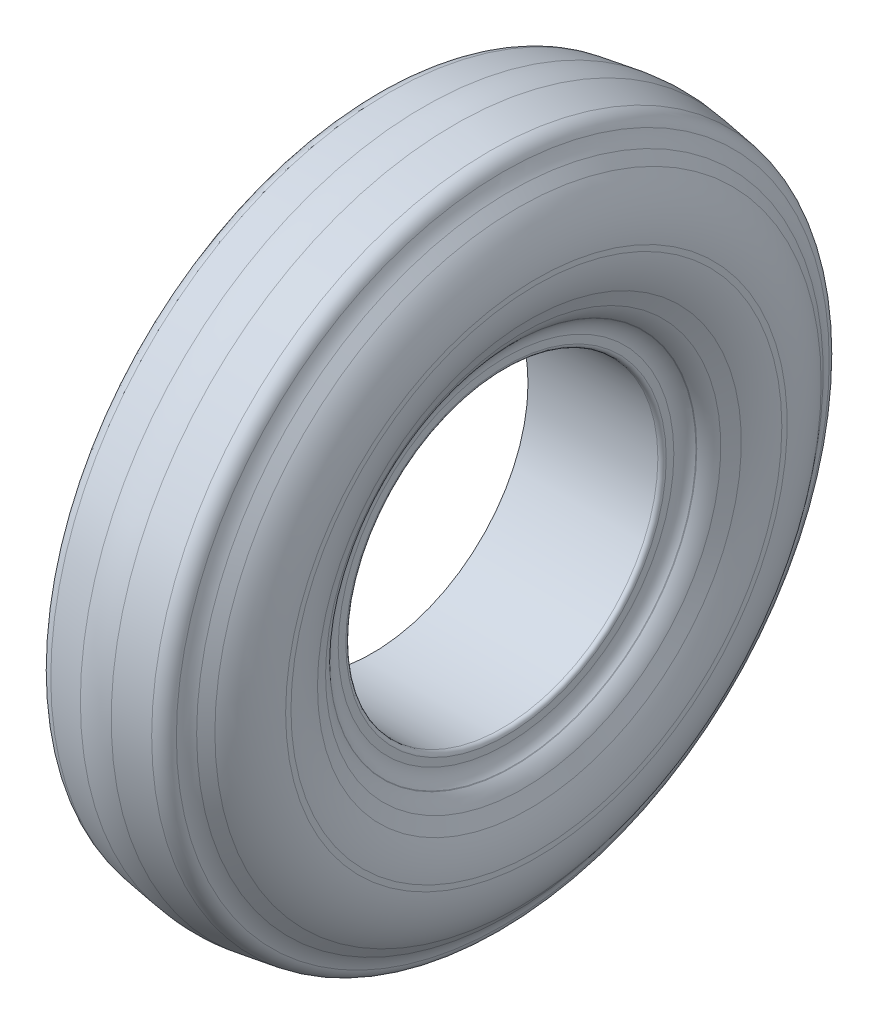
ISO-10303-21;
HEADER;
FILE_DESCRIPTION(('STEP AP214'),'2;1');
FILE_NAME('part.step','',(''),(''),'','','');
FILE_SCHEMA(('AUTOMOTIVE_DESIGN { 1 0 10303 214 1 1 1 1 }'));
ENDSEC;
DATA;
#1=APPLICATION_CONTEXT('core data for automotive mechanical design processes');
#2=APPLICATION_PROTOCOL_DEFINITION('international standard','automotive_design',2000,#1);
#3=PRODUCT_CONTEXT('',#1,'mechanical');
#4=PRODUCT('Part','Part','',(#3));
#5=PRODUCT_RELATED_PRODUCT_CATEGORY('part','',(#4));
#6=PRODUCT_DEFINITION_FORMATION('','',#4);
#7=PRODUCT_DEFINITION_CONTEXT('part definition',#1,'design');
#8=PRODUCT_DEFINITION('design','',#6,#7);
#9=PRODUCT_DEFINITION_SHAPE('','',#8);
#10=(LENGTH_UNIT() NAMED_UNIT(*) SI_UNIT(.MILLI.,.METRE.));
#11=(NAMED_UNIT(*) PLANE_ANGLE_UNIT() SI_UNIT($,.RADIAN.));
#12=(NAMED_UNIT(*) SI_UNIT($,.STERADIAN.) SOLID_ANGLE_UNIT());
#13=UNCERTAINTY_MEASURE_WITH_UNIT(LENGTH_MEASURE(1.E-05),#10,'distance_accuracy_value','');
#14=(GEOMETRIC_REPRESENTATION_CONTEXT(3) GLOBAL_UNCERTAINTY_ASSIGNED_CONTEXT((#13)) GLOBAL_UNIT_ASSIGNED_CONTEXT((#10,
#11,#12)) REPRESENTATION_CONTEXT('',''));
#15=CARTESIAN_POINT('',(0.,0.,0.));
#16=DIRECTION('',(0.,0.,1.));
#17=DIRECTION('',(1.,0.,0.));
#18=AXIS2_PLACEMENT_3D('',#15,#16,#17);
#19=CARTESIAN_POINT('',(0.,0.,0.));
#20=DIRECTION('',(-1.,0.,0.));
#21=DIRECTION('',(0.,0.,1.));
#22=AXIS2_PLACEMENT_3D('',#19,#20,#21);
#23=CYLINDRICAL_SURFACE('',#22,94.615);
#24=CARTESIAN_POINT('',(38.1,0.,0.));
#25=DIRECTION('',(-1.,0.,0.));
#26=DIRECTION('',(0.,0.,1.));
#27=AXIS2_PLACEMENT_3D('',#24,#25,#26);
#28=CIRCLE('',#27,94.615);
#29=CARTESIAN_POINT('',(38.1,0.,94.615));
#30=VERTEX_POINT('',#29);
#31=EDGE_CURVE('E10',#30,#30,#28,.F.);
#32=ORIENTED_EDGE('',*,*,#31,.T.);
#33=EDGE_LOOP('',(#32));
#34=FACE_BOUND('',#33,.T.);
#35=CARTESIAN_POINT('',(-40.64,0.,0.));
#36=DIRECTION('',(-1.,0.,0.));
#37=DIRECTION('',(0.,0.,1.));
#38=AXIS2_PLACEMENT_3D('',#35,#36,#37);
#39=CIRCLE('',#38,94.615);
#40=CARTESIAN_POINT('',(-40.64,0.,94.615));
#41=VERTEX_POINT('',#40);
#42=EDGE_CURVE('E121',#41,#41,#39,.T.);
#43=ORIENTED_EDGE('',*,*,#42,.T.);
#44=EDGE_LOOP('',(#43));
#45=FACE_BOUND('',#44,.T.);
#46=ADVANCED_FACE('F35',(#34,#45),#23,.F.);
#47=CARTESIAN_POINT('',(-40.64,94.615,0.));
#48=DIRECTION('',(1.,0.,0.));
#49=DIRECTION('',(0.,0.,-1.));
#50=AXIS2_PLACEMENT_3D('',#47,#48,#49);
#51=PLANE('',#50);
#52=CARTESIAN_POINT('',(-40.64,0.,0.));
#53=DIRECTION('',(1.,0.,0.));
#54=DIRECTION('',(0.,0.,-1.));
#55=AXIS2_PLACEMENT_3D('',#52,#53,#54);
#56=CIRCLE('',#55,101.754543356576);
#57=CARTESIAN_POINT('',(-40.64,0.,-101.754543356576));
#58=VERTEX_POINT('',#57);
#59=EDGE_CURVE('E118',#58,#58,#56,.F.);
#60=ORIENTED_EDGE('',*,*,#59,.T.);
#61=EDGE_LOOP('',(#60));
#62=FACE_BOUND('',#61,.T.);
#63=ORIENTED_EDGE('',*,*,#42,.F.);
#64=EDGE_LOOP('',(#63));
#65=FACE_BOUND('',#64,.T.);
#66=ADVANCED_FACE('F126',(#62,#65),#51,.F.);
#67=CARTESIAN_POINT('',(-48.895,0.,0.));
#68=DIRECTION('',(-1.,0.,0.));
#69=DIRECTION('',(0.,0.,1.));
#70=AXIS2_PLACEMENT_3D('',#67,#68,#69);
#71=CONICAL_SURFACE('',#70,114.935,0.745419476274158);
#72=CARTESIAN_POINT('',(-44.976770351513,0.,0.));
#73=DIRECTION('',(1.,0.,0.));
#74=DIRECTION('',(0.,0.,-1.));
#75=AXIS2_PLACEMENT_3D('',#72,#73,#74);
#76=CIRCLE('',#75,111.318172632166);
#77=CARTESIAN_POINT('',(-44.976770351513,0.,-111.318172632166));
#78=VERTEX_POINT('',#77);
#79=EDGE_CURVE('E106',#78,#78,#76,.F.);
#80=ORIENTED_EDGE('',*,*,#79,.T.);
#81=EDGE_LOOP('',(#80));
#82=FACE_BOUND('',#81,.T.);
#83=CARTESIAN_POINT('',(-44.7258426952901,0.,0.));
#84=DIRECTION('',(-1.,0.,0.));
#85=DIRECTION('',(0.,0.,1.));
#86=AXIS2_PLACEMENT_3D('',#83,#84,#85);
#87=CIRCLE('',#86,111.086547103345);
#88=CARTESIAN_POINT('',(-44.7258426952901,0.,111.086547103345));
#89=VERTEX_POINT('',#88);
#90=EDGE_CURVE('E115',#89,#89,#87,.F.);
#91=ORIENTED_EDGE('',*,*,#90,.T.);
#92=EDGE_LOOP('',(#91));
#93=FACE_BOUND('',#92,.T.);
#94=ADVANCED_FACE('F128',(#82,#93),#71,.F.);
#95=CARTESIAN_POINT('',(-59.055,0.,0.));
#96=DIRECTION('',(-1.,0.,0.));
#97=DIRECTION('',(0.,0.,1.));
#98=AXIS2_PLACEMENT_3D('',#95,#96,#97);
#99=CONICAL_SURFACE('',#98,138.214484530376,1.15927948072741);
#100=CARTESIAN_POINT('',(-54.8139690607513,0.,0.));
#101=DIRECTION('',(1.,0.,0.));
#102=DIRECTION('',(0.,0.,-1.));
#103=AXIS2_PLACEMENT_3D('',#100,#101,#102);
#104=CIRCLE('',#103,128.497061878497);
#105=CARTESIAN_POINT('',(-54.8139690607513,0.,-128.497061878497));
#106=VERTEX_POINT('',#105);
#107=EDGE_CURVE('E94',#106,#106,#104,.F.);
#108=ORIENTED_EDGE('',*,*,#107,.T.);
#109=EDGE_LOOP('',(#108));
#110=FACE_BOUND('',#109,.T.);
#111=CARTESIAN_POINT('',(-51.0279402724688,0.,0.));
#112=DIRECTION('',(1.,0.,0.));
#113=DIRECTION('',(0.,0.,-1.));
#114=AXIS2_PLACEMENT_3D('',#111,#112,#113);
#115=CIRCLE('',#114,119.822180125704);
#116=CARTESIAN_POINT('',(-51.0279402724688,0.,-119.822180125704));
#117=VERTEX_POINT('',#116);
#118=EDGE_CURVE('E103',#117,#117,#115,.T.);
#119=ORIENTED_EDGE('',*,*,#118,.T.);
#120=EDGE_LOOP('',(#119));
#121=FACE_BOUND('',#120,.T.);
#122=ADVANCED_FACE('F135',(#110,#121),#99,.F.);
#123=CARTESIAN_POINT('',(-59.055,138.214484530376,0.));
#124=DIRECTION('',(1.,0.,0.));
#125=DIRECTION('',(0.,0.,-1.));
#126=AXIS2_PLACEMENT_3D('',#123,#124,#125);
#127=PLANE('',#126);
#128=CARTESIAN_POINT('',(-59.055,0.,0.));
#129=DIRECTION('',(1.,0.,0.));
#130=DIRECTION('',(0.,0.,-1.));
#131=AXIS2_PLACEMENT_3D('',#128,#129,#130);
#132=CIRCLE('',#131,152.05073728983);
#133=CARTESIAN_POINT('',(-59.055,0.,-152.05073728983));
#134=VERTEX_POINT('',#133);
#135=EDGE_CURVE('E82',#134,#134,#132,.F.);
#136=ORIENTED_EDGE('',*,*,#135,.T.);
#137=EDGE_LOOP('',(#136));
#138=FACE_BOUND('',#137,.T.);
#139=CARTESIAN_POINT('',(-59.055,0.,0.));
#140=DIRECTION('',(1.,0.,0.));
#141=DIRECTION('',(0.,0.,-1.));
#142=AXIS2_PLACEMENT_3D('',#139,#140,#141);
#143=CIRCLE('',#142,148.817061878497);
#144=CARTESIAN_POINT('',(-59.055,0.,-148.817061878497));
#145=VERTEX_POINT('',#144);
#146=EDGE_CURVE('E91',#145,#145,#143,.T.);
#147=ORIENTED_EDGE('',*,*,#146,.T.);
#148=EDGE_LOOP('',(#147));
#149=FACE_BOUND('',#148,.T.);
#150=ADVANCED_FACE('F214',(#138,#149),#127,.F.);
#151=CARTESIAN_POINT('',(-40.005,0.,0.));
#152=DIRECTION('',(1.,0.,0.));
#153=DIRECTION('',(0.,0.,-1.));
#154=AXIS2_PLACEMENT_3D('',#151,#152,#153);
#155=CONICAL_SURFACE('',#154,193.675,0.895664793857865);
#156=CARTESIAN_POINT('',(-42.9943062941736,0.,0.));
#157=DIRECTION('',(1.,0.,0.));
#158=DIRECTION('',(0.,0.,-1.));
#159=AXIS2_PLACEMENT_3D('',#156,#157,#158);
#160=CIRCLE('',#159,189.941357635257);
#161=CARTESIAN_POINT('',(-42.9943062941736,0.,-189.941357635257));
#162=VERTEX_POINT('',#161);
#163=EDGE_CURVE('E70',#162,#162,#160,.F.);
#164=ORIENTED_EDGE('',*,*,#163,.T.);
#165=EDGE_LOOP('',(#164));
#166=FACE_BOUND('',#165,.T.);
#167=CARTESIAN_POINT('',(-47.9107372898298,0.,0.));
#168=DIRECTION('',(-1.,0.,0.));
#169=DIRECTION('',(0.,0.,1.));
#170=AXIS2_PLACEMENT_3D('',#167,#168,#169);
#171=CIRCLE('',#170,183.80073728983);
#172=CARTESIAN_POINT('',(-47.9107372898298,0.,183.80073728983));
#173=VERTEX_POINT('',#172);
#174=EDGE_CURVE('E79',#173,#173,#171,.F.);
#175=ORIENTED_EDGE('',*,*,#174,.T.);
#176=EDGE_LOOP('',(#175));
#177=FACE_BOUND('',#176,.T.);
#178=ADVANCED_FACE('F204',(#166,#177),#155,.T.);
#179=CARTESIAN_POINT('',(0.,0.,0.));
#180=DIRECTION('',(1.,0.,0.));
#181=DIRECTION('',(0.,0.,-1.));
#182=AXIS2_PLACEMENT_3D('',#179,#180,#181);
#183=CONICAL_SURFACE('',#182,209.55,0.15394466445835);
#184=CARTESIAN_POINT('',(-9.34744362653417,0.,0.));
#185=DIRECTION('',(-1.,0.,0.));
#186=DIRECTION('',(0.,0.,1.));
#187=AXIS2_PLACEMENT_3D('',#184,#185,#186);
#188=CIRCLE('',#187,208.099534609676);
#189=CARTESIAN_POINT('',(-9.34744362653417,0.,208.099534609676));
#190=VERTEX_POINT('',#189);
#191=EDGE_CURVE('E50',#190,#190,#188,.T.);
#192=ORIENTED_EDGE('',*,*,#191,.T.);
#193=EDGE_LOOP('',(#192));
#194=FACE_BOUND('',#193,.T.);
#195=CARTESIAN_POINT('',(-30.581011213572,0.,0.));
#196=DIRECTION('',(-1.,0.,0.));
#197=DIRECTION('',(0.,0.,1.));
#198=AXIS2_PLACEMENT_3D('',#195,#196,#197);
#199=CIRCLE('',#198,204.804670673756);
#200=CARTESIAN_POINT('',(-30.581011213572,0.,204.804670673756));
#201=VERTEX_POINT('',#200);
#202=EDGE_CURVE('E61',#201,#201,#199,.F.);
#203=ORIENTED_EDGE('',*,*,#202,.T.);
#204=EDGE_LOOP('',(#203));
#205=FACE_BOUND('',#204,.T.);
#206=ADVANCED_FACE('F200',(#194,#205),#183,.T.);
#207=CARTESIAN_POINT('',(36.83,0.,0.));
#208=DIRECTION('',(-1.,0.,0.));
#209=DIRECTION('',(0.,0.,1.));
#210=AXIS2_PLACEMENT_3D('',#207,#208,#209);
#211=CONICAL_SURFACE('',#210,203.835,0.15394466445835);
#212=CARTESIAN_POINT('',(9.34744362653417,0.,0.));
#213=DIRECTION('',(1.,0.,0.));
#214=DIRECTION('',(0.,0.,-1.));
#215=AXIS2_PLACEMENT_3D('',#212,#213,#214);
#216=CIRCLE('',#215,208.099534609676);
#217=CARTESIAN_POINT('',(9.34744362653417,0.,-208.099534609676));
#218=VERTEX_POINT('',#217);
#219=EDGE_CURVE('E46',#218,#218,#216,.T.);
#220=ORIENTED_EDGE('',*,*,#219,.T.);
#221=EDGE_LOOP('',(#220));
#222=FACE_BOUND('',#221,.T.);
#223=CARTESIAN_POINT('',(30.581011213572,0.,0.));
#224=DIRECTION('',(1.,0.,0.));
#225=DIRECTION('',(0.,0.,-1.));
#226=AXIS2_PLACEMENT_3D('',#223,#224,#225);
#227=CIRCLE('',#226,204.804670673756);
#228=CARTESIAN_POINT('',(30.581011213572,0.,-204.804670673756));
#229=VERTEX_POINT('',#228);
#230=EDGE_CURVE('E58',#229,#229,#227,.F.);
#231=ORIENTED_EDGE('',*,*,#230,.T.);
#232=EDGE_LOOP('',(#231));
#233=FACE_BOUND('',#232,.T.);
#234=ADVANCED_FACE('F203',(#222,#233),#211,.T.);
#235=CARTESIAN_POINT('',(59.055,0.,0.));
#236=DIRECTION('',(-1.,0.,0.));
#237=DIRECTION('',(0.,0.,1.));
#238=AXIS2_PLACEMENT_3D('',#235,#236,#237);
#239=CONICAL_SURFACE('',#238,169.881557626102,0.895664793857865);
#240=CARTESIAN_POINT('',(42.9943062941735,0.,0.));
#241=DIRECTION('',(-1.,0.,0.));
#242=DIRECTION('',(0.,0.,1.));
#243=AXIS2_PLACEMENT_3D('',#240,#241,#242);
#244=CIRCLE('',#243,189.941357635257);
#245=CARTESIAN_POINT('',(42.9943062941735,0.,189.941357635257));
#246=VERTEX_POINT('',#245);
#247=EDGE_CURVE('E67',#246,#246,#244,.F.);
#248=ORIENTED_EDGE('',*,*,#247,.T.);
#249=EDGE_LOOP('',(#248));
#250=FACE_BOUND('',#249,.T.);
#251=CARTESIAN_POINT('',(47.9107372898298,0.,0.));
#252=DIRECTION('',(1.,0.,0.));
#253=DIRECTION('',(0.,0.,-1.));
#254=AXIS2_PLACEMENT_3D('',#251,#252,#253);
#255=CIRCLE('',#254,183.80073728983);
#256=CARTESIAN_POINT('',(47.9107372898298,0.,-183.80073728983));
#257=VERTEX_POINT('',#256);
#258=EDGE_CURVE('E76',#257,#257,#255,.F.);
#259=ORIENTED_EDGE('',*,*,#258,.T.);
#260=EDGE_LOOP('',(#259));
#261=FACE_BOUND('',#260,.T.);
#262=ADVANCED_FACE('F241',(#250,#261),#239,.T.);
#263=CARTESIAN_POINT('',(59.055,138.214484530376,0.));
#264=DIRECTION('',(-1.,0.,0.));
#265=DIRECTION('',(0.,0.,1.));
#266=AXIS2_PLACEMENT_3D('',#263,#264,#265);
#267=PLANE('',#266);
#268=CARTESIAN_POINT('',(59.055,0.,0.));
#269=DIRECTION('',(-1.,0.,0.));
#270=DIRECTION('',(0.,0.,1.));
#271=AXIS2_PLACEMENT_3D('',#268,#269,#270);
#272=CIRCLE('',#271,152.05073728983);
#273=CARTESIAN_POINT('',(59.055,0.,152.05073728983));
#274=VERTEX_POINT('',#273);
#275=EDGE_CURVE('E73',#274,#274,#272,.F.);
#276=ORIENTED_EDGE('',*,*,#275,.T.);
#277=EDGE_LOOP('',(#276));
#278=FACE_BOUND('',#277,.T.);
#279=CARTESIAN_POINT('',(59.055,0.,0.));
#280=DIRECTION('',(-1.,0.,0.));
#281=DIRECTION('',(0.,0.,1.));
#282=AXIS2_PLACEMENT_3D('',#279,#280,#281);
#283=CIRCLE('',#282,148.817061878497);
#284=CARTESIAN_POINT('',(59.055,0.,148.817061878497));
#285=VERTEX_POINT('',#284);
#286=EDGE_CURVE('E88',#285,#285,#283,.T.);
#287=ORIENTED_EDGE('',*,*,#286,.T.);
#288=EDGE_LOOP('',(#287));
#289=FACE_BOUND('',#288,.T.);
#290=ADVANCED_FACE('F245',(#278,#289),#267,.F.);
#291=CARTESIAN_POINT('',(48.895,0.,0.));
#292=DIRECTION('',(1.,0.,0.));
#293=DIRECTION('',(0.,0.,-1.));
#294=AXIS2_PLACEMENT_3D('',#291,#292,#293);
#295=CONICAL_SURFACE('',#294,114.935,1.15927948072741);
#296=CARTESIAN_POINT('',(54.8139690607513,0.,0.));
#297=DIRECTION('',(-1.,0.,0.));
#298=DIRECTION('',(0.,0.,1.));
#299=AXIS2_PLACEMENT_3D('',#296,#297,#298);
#300=CIRCLE('',#299,128.497061878497);
#301=CARTESIAN_POINT('',(54.8139690607513,0.,128.497061878497));
#302=VERTEX_POINT('',#301);
#303=EDGE_CURVE('E85',#302,#302,#300,.F.);
#304=ORIENTED_EDGE('',*,*,#303,.T.);
#305=EDGE_LOOP('',(#304));
#306=FACE_BOUND('',#305,.T.);
#307=CARTESIAN_POINT('',(51.0279402724688,0.,0.));
#308=DIRECTION('',(-1.,0.,0.));
#309=DIRECTION('',(0.,0.,1.));
#310=AXIS2_PLACEMENT_3D('',#307,#308,#309);
#311=CIRCLE('',#310,119.822180125704);
#312=CARTESIAN_POINT('',(51.0279402724688,0.,119.822180125704));
#313=VERTEX_POINT('',#312);
#314=EDGE_CURVE('E100',#313,#313,#311,.T.);
#315=ORIENTED_EDGE('',*,*,#314,.T.);
#316=EDGE_LOOP('',(#315));
#317=FACE_BOUND('',#316,.T.);
#318=ADVANCED_FACE('F249',(#306,#317),#295,.F.);
#319=CARTESIAN_POINT('',(40.64,0.,0.));
#320=DIRECTION('',(1.,0.,0.));
#321=DIRECTION('',(0.,0.,-1.));
#322=AXIS2_PLACEMENT_3D('',#319,#320,#321);
#323=CONICAL_SURFACE('',#322,107.315,0.745419476274158);
#324=CARTESIAN_POINT('',(44.976770351513,0.,0.));
#325=DIRECTION('',(-1.,0.,0.));
#326=DIRECTION('',(0.,0.,1.));
#327=AXIS2_PLACEMENT_3D('',#324,#325,#326);
#328=CIRCLE('',#327,111.318172632166);
#329=CARTESIAN_POINT('',(44.976770351513,0.,111.318172632166));
#330=VERTEX_POINT('',#329);
#331=EDGE_CURVE('E97',#330,#330,#328,.F.);
#332=ORIENTED_EDGE('',*,*,#331,.T.);
#333=EDGE_LOOP('',(#332));
#334=FACE_BOUND('',#333,.T.);
#335=CARTESIAN_POINT('',(44.7258426952901,0.,0.));
#336=DIRECTION('',(1.,0.,0.));
#337=DIRECTION('',(0.,0.,-1.));
#338=AXIS2_PLACEMENT_3D('',#335,#336,#337);
#339=CIRCLE('',#338,111.086547103345);
#340=CARTESIAN_POINT('',(44.7258426952901,0.,-111.086547103345));
#341=VERTEX_POINT('',#340);
#342=EDGE_CURVE('E112',#341,#341,#339,.F.);
#343=ORIENTED_EDGE('',*,*,#342,.T.);
#344=EDGE_LOOP('',(#343));
#345=FACE_BOUND('',#344,.T.);
#346=ADVANCED_FACE('F253',(#334,#345),#323,.F.);
#347=CARTESIAN_POINT('',(40.64,94.615,0.));
#348=DIRECTION('',(-1.,0.,0.));
#349=DIRECTION('',(0.,0.,1.));
#350=AXIS2_PLACEMENT_3D('',#347,#348,#349);
#351=PLANE('',#350);
#352=CARTESIAN_POINT('',(40.64,0.,0.));
#353=DIRECTION('',(-1.,0.,0.));
#354=DIRECTION('',(0.,0.,1.));
#355=AXIS2_PLACEMENT_3D('',#352,#353,#354);
#356=CIRCLE('',#355,97.155);
#357=CARTESIAN_POINT('',(40.64,0.,97.155));
#358=VERTEX_POINT('',#357);
#359=EDGE_CURVE('E42',#358,#358,#356,.T.);
#360=ORIENTED_EDGE('',*,*,#359,.T.);
#361=EDGE_LOOP('',(#360));
#362=FACE_BOUND('',#361,.T.);
#363=CARTESIAN_POINT('',(40.64,0.,0.));
#364=DIRECTION('',(-1.,0.,0.));
#365=DIRECTION('',(0.,0.,1.));
#366=AXIS2_PLACEMENT_3D('',#363,#364,#365);
#367=CIRCLE('',#366,101.754543356576);
#368=CARTESIAN_POINT('',(40.64,0.,101.754543356576));
#369=VERTEX_POINT('',#368);
#370=EDGE_CURVE('E109',#369,#369,#367,.F.);
#371=ORIENTED_EDGE('',*,*,#370,.T.);
#372=EDGE_LOOP('',(#371));
#373=FACE_BOUND('',#372,.T.);
#374=ADVANCED_FACE('F145',(#362,#373),#351,.F.);
#375=CARTESIAN_POINT('',(-53.34,0.,0.));
#376=DIRECTION('',(1.,0.,0.));
#377=DIRECTION('',(0.,0.,-1.));
#378=AXIS2_PLACEMENT_3D('',#375,#376,#377);
#379=TOROIDAL_SURFACE('',#378,101.754543356576,12.7);
#380=ORIENTED_EDGE('',*,*,#90,.F.);
#381=EDGE_LOOP('',(#380));
#382=FACE_BOUND('',#381,.T.);
#383=ORIENTED_EDGE('',*,*,#59,.F.);
#384=EDGE_LOOP('',(#383));
#385=FACE_BOUND('',#384,.T.);
#386=ADVANCED_FACE('F141',(#382,#385),#379,.F.);
#387=CARTESIAN_POINT('',(53.34,0.,0.));
#388=DIRECTION('',(-1.,0.,0.));
#389=DIRECTION('',(0.,0.,1.));
#390=AXIS2_PLACEMENT_3D('',#387,#388,#389);
#391=TOROIDAL_SURFACE('',#390,101.754543356576,12.7);
#392=ORIENTED_EDGE('',*,*,#370,.F.);
#393=EDGE_LOOP('',(#392));
#394=FACE_BOUND('',#393,.T.);
#395=ORIENTED_EDGE('',*,*,#342,.F.);
#396=EDGE_LOOP('',(#395));
#397=FACE_BOUND('',#396,.T.);
#398=ADVANCED_FACE('F144',(#394,#397),#391,.F.);
#399=CARTESIAN_POINT('',(-27.7484557420931,0.,0.));
#400=DIRECTION('',(1.,0.,0.));
#401=DIRECTION('',(0.,0.,-1.));
#402=AXIS2_PLACEMENT_3D('',#399,#400,#401);
#403=TOROIDAL_SURFACE('',#402,129.982180125704,25.4);
#404=ORIENTED_EDGE('',*,*,#118,.F.);
#405=EDGE_LOOP('',(#404));
#406=FACE_BOUND('',#405,.T.);
#407=ORIENTED_EDGE('',*,*,#79,.F.);
#408=EDGE_LOOP('',(#407));
#409=FACE_BOUND('',#408,.T.);
#410=ADVANCED_FACE('F149',(#406,#409),#403,.T.);
#411=CARTESIAN_POINT('',(27.7484557420931,0.,0.));
#412=DIRECTION('',(1.,0.,0.));
#413=DIRECTION('',(0.,0.,-1.));
#414=AXIS2_PLACEMENT_3D('',#411,#412,#413);
#415=TOROIDAL_SURFACE('',#414,129.982180125704,25.4);
#416=ORIENTED_EDGE('',*,*,#331,.F.);
#417=EDGE_LOOP('',(#416));
#418=FACE_BOUND('',#417,.T.);
#419=ORIENTED_EDGE('',*,*,#314,.F.);
#420=EDGE_LOOP('',(#419));
#421=FACE_BOUND('',#420,.T.);
#422=ADVANCED_FACE('F153',(#418,#421),#415,.T.);
#423=CARTESIAN_POINT('',(-8.255,0.,0.));
#424=DIRECTION('',(1.,0.,0.));
#425=DIRECTION('',(0.,0.,-1.));
#426=AXIS2_PLACEMENT_3D('',#423,#424,#425);
#427=TOROIDAL_SURFACE('',#426,148.817061878497,50.8);
#428=ORIENTED_EDGE('',*,*,#146,.F.);
#429=EDGE_LOOP('',(#428));
#430=FACE_BOUND('',#429,.T.);
#431=ORIENTED_EDGE('',*,*,#107,.F.);
#432=EDGE_LOOP('',(#431));
#433=FACE_BOUND('',#432,.T.);
#434=ADVANCED_FACE('F157',(#430,#433),#427,.T.);
#435=CARTESIAN_POINT('',(8.255,0.,0.));
#436=DIRECTION('',(-1.,0.,0.));
#437=DIRECTION('',(0.,0.,1.));
#438=AXIS2_PLACEMENT_3D('',#435,#436,#437);
#439=TOROIDAL_SURFACE('',#438,148.817061878497,50.8);
#440=ORIENTED_EDGE('',*,*,#303,.F.);
#441=EDGE_LOOP('',(#440));
#442=FACE_BOUND('',#441,.T.);
#443=ORIENTED_EDGE('',*,*,#286,.F.);
#444=EDGE_LOOP('',(#443));
#445=FACE_BOUND('',#444,.T.);
#446=ADVANCED_FACE('F161',(#442,#445),#439,.T.);
#447=CARTESIAN_POINT('',(-8.255,0.,0.));
#448=DIRECTION('',(1.,0.,0.));
#449=DIRECTION('',(0.,0.,-1.));
#450=AXIS2_PLACEMENT_3D('',#447,#448,#449);
#451=TOROIDAL_SURFACE('',#450,152.05073728983,50.8);
#452=ORIENTED_EDGE('',*,*,#174,.F.);
#453=EDGE_LOOP('',(#452));
#454=FACE_BOUND('',#453,.T.);
#455=ORIENTED_EDGE('',*,*,#135,.F.);
#456=EDGE_LOOP('',(#455));
#457=FACE_BOUND('',#456,.T.);
#458=ADVANCED_FACE('F165',(#454,#457),#451,.T.);
#459=CARTESIAN_POINT('',(8.255,0.,0.));
#460=DIRECTION('',(-1.,0.,0.));
#461=DIRECTION('',(0.,0.,1.));
#462=AXIS2_PLACEMENT_3D('',#459,#460,#461);
#463=TOROIDAL_SURFACE('',#462,152.05073728983,50.8);
#464=ORIENTED_EDGE('',*,*,#275,.F.);
#465=EDGE_LOOP('',(#464));
#466=FACE_BOUND('',#465,.T.);
#467=ORIENTED_EDGE('',*,*,#258,.F.);
#468=EDGE_LOOP('',(#467));
#469=FACE_BOUND('',#468,.T.);
#470=ADVANCED_FACE('F169',(#466,#469),#463,.T.);
#471=CARTESIAN_POINT('',(-62.8221749390884,0.,0.));
#472=DIRECTION('',(-1.,0.,0.));
#473=DIRECTION('',(0.,0.,1.));
#474=AXIS2_PLACEMENT_3D('',#471,#472,#473);
#475=TOROIDAL_SURFACE('',#474,205.816357635257,25.4);
#476=CARTESIAN_POINT('',(-38.6799813700839,0.,0.));
#477=DIRECTION('',(-1.,0.,0.));
#478=DIRECTION('',(0.,0.,1.));
#479=AXIS2_PLACEMENT_3D('',#476,#477,#478);
#480=CIRCLE('',#479,197.92240490695);
#481=CARTESIAN_POINT('',(-38.6799813700839,0.,197.92240490695));
#482=VERTEX_POINT('',#481);
#483=EDGE_CURVE('E64',#482,#482,#480,.T.);
#484=ORIENTED_EDGE('',*,*,#483,.T.);
#485=EDGE_LOOP('',(#484));
#486=FACE_BOUND('',#485,.T.);
#487=ORIENTED_EDGE('',*,*,#163,.F.);
#488=EDGE_LOOP('',(#487));
#489=FACE_BOUND('',#488,.T.);
#490=ADVANCED_FACE('F173',(#486,#489),#475,.F.);
#491=CARTESIAN_POINT('',(62.8221749390884,0.,0.));
#492=DIRECTION('',(-1.,0.,0.));
#493=DIRECTION('',(0.,0.,1.));
#494=AXIS2_PLACEMENT_3D('',#491,#492,#493);
#495=TOROIDAL_SURFACE('',#494,205.816357635257,25.4);
#496=CARTESIAN_POINT('',(38.6799813700839,0.,0.));
#497=DIRECTION('',(1.,0.,0.));
#498=DIRECTION('',(0.,0.,-1.));
#499=AXIS2_PLACEMENT_3D('',#496,#497,#498);
#500=CIRCLE('',#499,197.92240490695);
#501=CARTESIAN_POINT('',(38.6799813700839,0.,-197.92240490695));
#502=VERTEX_POINT('',#501);
#503=EDGE_CURVE('E55',#502,#502,#500,.T.);
#504=ORIENTED_EDGE('',*,*,#503,.T.);
#505=EDGE_LOOP('',(#504));
#506=FACE_BOUND('',#505,.T.);
#507=ORIENTED_EDGE('',*,*,#247,.F.);
#508=EDGE_LOOP('',(#507));
#509=FACE_BOUND('',#508,.T.);
#510=ADVANCED_FACE('F177',(#506,#509),#495,.F.);
#511=CARTESIAN_POINT('',(-29.0231039424832,0.,0.));
#512=DIRECTION('',(1.,0.,0.));
#513=DIRECTION('',(0.,0.,-1.));
#514=AXIS2_PLACEMENT_3D('',#511,#512,#513);
#515=TOROIDAL_SURFACE('',#514,194.764823815627,10.16);
#516=ORIENTED_EDGE('',*,*,#202,.F.);
#517=EDGE_LOOP('',(#516));
#518=FACE_BOUND('',#517,.T.);
#519=ORIENTED_EDGE('',*,*,#483,.F.);
#520=EDGE_LOOP('',(#519));
#521=FACE_BOUND('',#520,.T.);
#522=ADVANCED_FACE('F181',(#518,#521),#515,.T.);
#523=CARTESIAN_POINT('',(29.0231039424832,0.,0.));
#524=DIRECTION('',(1.,0.,0.));
#525=DIRECTION('',(0.,0.,-1.));
#526=AXIS2_PLACEMENT_3D('',#523,#524,#525);
#527=TOROIDAL_SURFACE('',#526,194.764823815627,10.16);
#528=ORIENTED_EDGE('',*,*,#503,.F.);
#529=EDGE_LOOP('',(#528));
#530=FACE_BOUND('',#529,.T.);
#531=ORIENTED_EDGE('',*,*,#230,.F.);
#532=EDGE_LOOP('',(#531));
#533=FACE_BOUND('',#532,.T.);
#534=ADVANCED_FACE('F185',(#530,#533),#527,.T.);
#535=CARTESIAN_POINT('',(0.,0.,0.));
#536=DIRECTION('',(1.,0.,0.));
#537=DIRECTION('',(0.,0.,-1.));
#538=AXIS2_PLACEMENT_3D('',#535,#536,#537);
#539=TOROIDAL_SURFACE('',#538,147.8604534609,60.96);
#540=ORIENTED_EDGE('',*,*,#219,.F.);
#541=EDGE_LOOP('',(#540));
#542=FACE_BOUND('',#541,.T.);
#543=ORIENTED_EDGE('',*,*,#191,.F.);
#544=EDGE_LOOP('',(#543));
#545=FACE_BOUND('',#544,.T.);
#546=ADVANCED_FACE('F188',(#542,#545),#539,.T.);
#547=CARTESIAN_POINT('',(38.1,0.,0.));
#548=DIRECTION('',(-1.,0.,0.));
#549=DIRECTION('',(0.,0.,1.));
#550=AXIS2_PLACEMENT_3D('',#547,#548,#549);
#551=TOROIDAL_SURFACE('',#550,97.155,2.54);
#552=ORIENTED_EDGE('',*,*,#31,.F.);
#553=EDGE_LOOP('',(#552));
#554=FACE_BOUND('',#553,.T.);
#555=ORIENTED_EDGE('',*,*,#359,.F.);
#556=EDGE_LOOP('',(#555));
#557=FACE_BOUND('',#556,.T.);
#558=ADVANCED_FACE('F37',(#554,#557),#551,.T.);
#559=CLOSED_SHELL('',(#46,#66,#94,#122,#150,#178,#206,#234,#262,#290,#318,#346,#374,#386,#398,
#410,#422,#434,#446,#458,#470,#490,#510,#522,#534,#546,#558));
#560=MANIFOLD_SOLID_BREP('B2',#559);
#561=ADVANCED_BREP_SHAPE_REPRESENTATION('',(#18,#560),#14);
#562=SHAPE_DEFINITION_REPRESENTATION(#9,#561);
ENDSEC;
END-ISO-10303-21;
